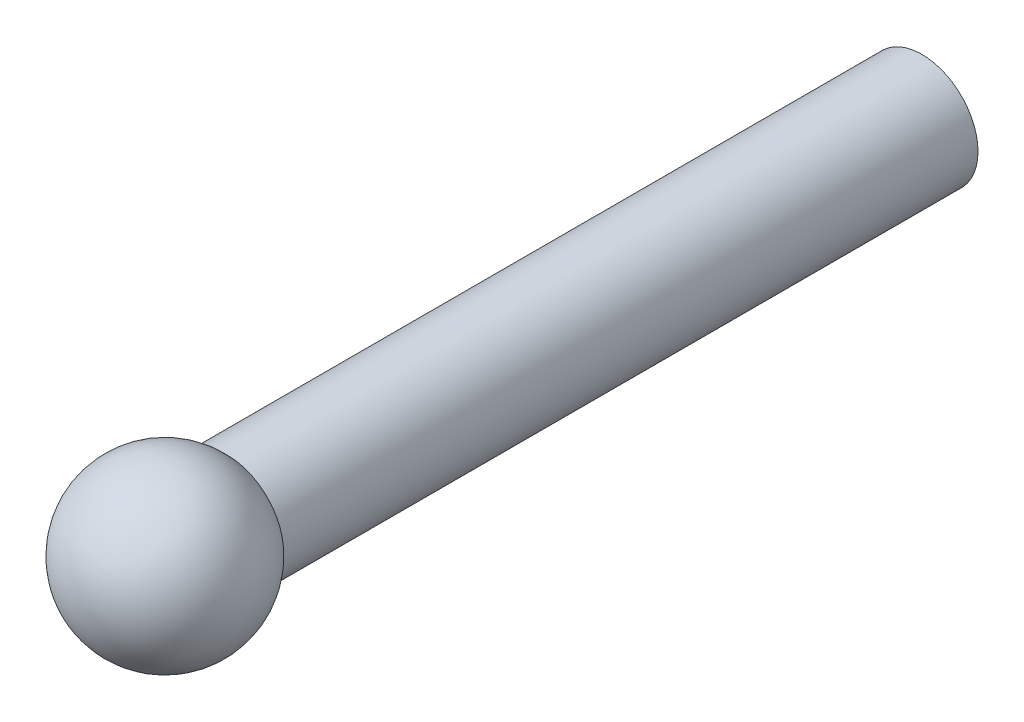
ISO-10303-21;
HEADER;
FILE_DESCRIPTION(('STEP AP214'),'2;1');
FILE_NAME('part.step','',(''),(''),'','','');
FILE_SCHEMA(('AUTOMOTIVE_DESIGN { 1 0 10303 214 1 1 1 1 }'));
ENDSEC;
DATA;
#1=APPLICATION_CONTEXT('core data for automotive mechanical design processes');
#2=APPLICATION_PROTOCOL_DEFINITION('international standard','automotive_design',2000,#1);
#3=PRODUCT_CONTEXT('',#1,'mechanical');
#4=PRODUCT('Part','Part','',(#3));
#5=PRODUCT_RELATED_PRODUCT_CATEGORY('part','',(#4));
#6=PRODUCT_DEFINITION_FORMATION('','',#4);
#7=PRODUCT_DEFINITION_CONTEXT('part definition',#1,'design');
#8=PRODUCT_DEFINITION('design','',#6,#7);
#9=PRODUCT_DEFINITION_SHAPE('','',#8);
#10=(LENGTH_UNIT() NAMED_UNIT(*) SI_UNIT(.MILLI.,.METRE.));
#11=(NAMED_UNIT(*) PLANE_ANGLE_UNIT() SI_UNIT($,.RADIAN.));
#12=(NAMED_UNIT(*) SI_UNIT($,.STERADIAN.) SOLID_ANGLE_UNIT());
#13=UNCERTAINTY_MEASURE_WITH_UNIT(LENGTH_MEASURE(1.E-05),#10,'distance_accuracy_value','');
#14=(GEOMETRIC_REPRESENTATION_CONTEXT(3) GLOBAL_UNCERTAINTY_ASSIGNED_CONTEXT((#13)) GLOBAL_UNIT_ASSIGNED_CONTEXT((#10,
#11,#12)) REPRESENTATION_CONTEXT('',''));
#15=CARTESIAN_POINT('',(0.,0.,0.));
#16=DIRECTION('',(0.,0.,1.));
#17=DIRECTION('',(1.,0.,0.));
#18=AXIS2_PLACEMENT_3D('',#15,#16,#17);
#19=CARTESIAN_POINT('',(0.,0.,27.));
#20=DIRECTION('',(-1.,0.,0.));
#21=DIRECTION('',(0.,0.,-1.));
#22=AXIS2_PLACEMENT_3D('',#19,#20,#21);
#23=SPHERICAL_SURFACE('',#22,3.);
#24=CARTESIAN_POINT('',(0.,0.,27.));
#25=DIRECTION('',(0.,0.,1.));
#26=DIRECTION('',(1.,0.,0.));
#27=AXIS2_PLACEMENT_3D('',#24,#25,#26);
#28=SPHERICAL_SURFACE('',#27,3.);
#29=CARTESIAN_POINT('',(0.,0.,24.7639320225002));
#30=DIRECTION('',(0.,0.,1.));
#31=DIRECTION('',(1.,0.,0.));
#32=AXIS2_PLACEMENT_3D('',#29,#30,#31);
#33=CIRCLE('',#32,2.);
#34=CARTESIAN_POINT('',(2.,0.,24.7639320225002));
#35=VERTEX_POINT('',#34);
#36=EDGE_CURVE('E37',#35,#35,#33,.F.);
#37=ORIENTED_EDGE('',*,*,#36,.F.);
#38=EDGE_LOOP('',(#37));
#39=FACE_BOUND('',#38,.T.);
#40=ADVANCED_FACE('F33',(#39),#28,.T.);
#41=CARTESIAN_POINT('',(0.,0.,25.));
#42=DIRECTION('',(0.,0.,-1.));
#43=DIRECTION('',(-1.,0.,0.));
#44=AXIS2_PLACEMENT_3D('',#41,#42,#43);
#45=CYLINDRICAL_SURFACE('',#44,2.);
#46=ORIENTED_EDGE('',*,*,#36,.T.);
#47=EDGE_LOOP('',(#46));
#48=FACE_BOUND('',#47,.T.);
#49=CARTESIAN_POINT('',(0.,0.,0.));
#50=DIRECTION('',(0.,0.,1.));
#51=DIRECTION('',(1.,0.,0.));
#52=AXIS2_PLACEMENT_3D('',#49,#50,#51);
#53=CIRCLE('',#52,2.);
#54=CARTESIAN_POINT('',(2.,0.,0.));
#55=VERTEX_POINT('',#54);
#56=EDGE_CURVE('E10',#55,#55,#53,.T.);
#57=ORIENTED_EDGE('',*,*,#56,.T.);
#58=EDGE_LOOP('',(#57));
#59=FACE_BOUND('',#58,.T.);
#60=ADVANCED_FACE('F35',(#48,#59),#45,.T.);
#61=CARTESIAN_POINT('',(0.,0.,0.));
#62=DIRECTION('',(0.,0.,1.));
#63=DIRECTION('',(1.,0.,0.));
#64=AXIS2_PLACEMENT_3D('',#61,#62,#63);
#65=PLANE('',#64);
#66=ORIENTED_EDGE('',*,*,#56,.F.);
#67=EDGE_LOOP('',(#66));
#68=FACE_BOUND('',#67,.T.);
#69=ADVANCED_FACE('F52',(#68),#65,.F.);
#70=CLOSED_SHELL('',(#40,#60,#69));
#71=MANIFOLD_SOLID_BREP('B2',#70);
#72=ADVANCED_BREP_SHAPE_REPRESENTATION('',(#18,#71),#14);
#73=SHAPE_DEFINITION_REPRESENTATION(#9,#72);
ENDSEC;
END-ISO-10303-21;
